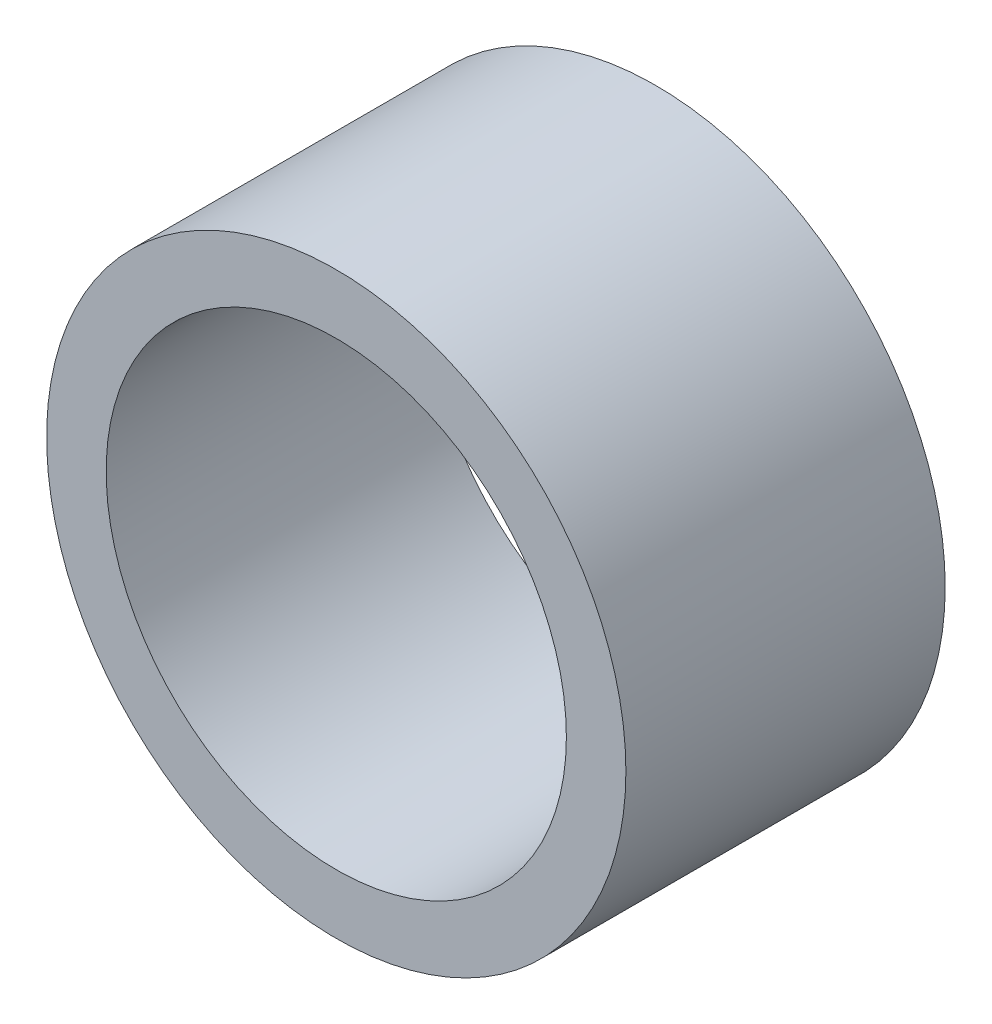
ISO-10303-21;
HEADER;
FILE_DESCRIPTION(('STEP AP214'),'2;1');
FILE_NAME('part.step','',(''),(''),'','','');
FILE_SCHEMA(('AUTOMOTIVE_DESIGN { 1 0 10303 214 1 1 1 1 }'));
ENDSEC;
DATA;
#1=APPLICATION_CONTEXT('core data for automotive mechanical design processes');
#2=APPLICATION_PROTOCOL_DEFINITION('international standard','automotive_design',2000,#1);
#3=PRODUCT_CONTEXT('',#1,'mechanical');
#4=PRODUCT('Part','Part','',(#3));
#5=PRODUCT_RELATED_PRODUCT_CATEGORY('part','',(#4));
#6=PRODUCT_DEFINITION_FORMATION('','',#4);
#7=PRODUCT_DEFINITION_CONTEXT('part definition',#1,'design');
#8=PRODUCT_DEFINITION('design','',#6,#7);
#9=PRODUCT_DEFINITION_SHAPE('','',#8);
#10=(LENGTH_UNIT() NAMED_UNIT(*) SI_UNIT(.MILLI.,.METRE.));
#11=(NAMED_UNIT(*) PLANE_ANGLE_UNIT() SI_UNIT($,.RADIAN.));
#12=(NAMED_UNIT(*) SI_UNIT($,.STERADIAN.) SOLID_ANGLE_UNIT());
#13=UNCERTAINTY_MEASURE_WITH_UNIT(LENGTH_MEASURE(1.E-05),#10,'distance_accuracy_value','');
#14=(GEOMETRIC_REPRESENTATION_CONTEXT(3) GLOBAL_UNCERTAINTY_ASSIGNED_CONTEXT((#13)) GLOBAL_UNIT_ASSIGNED_CONTEXT((#10,
#11,#12)) REPRESENTATION_CONTEXT('',''));
#15=CARTESIAN_POINT('',(0.,0.,0.));
#16=DIRECTION('',(0.,0.,1.));
#17=DIRECTION('',(1.,0.,0.));
#18=AXIS2_PLACEMENT_3D('',#15,#16,#17);
#19=CARTESIAN_POINT('',(0.,0.,-7.));
#20=DIRECTION('',(0.,0.,1.));
#21=DIRECTION('',(1.,0.,0.));
#22=AXIS2_PLACEMENT_3D('',#19,#20,#21);
#23=CYLINDRICAL_SURFACE('',#22,6.35);
#24=CARTESIAN_POINT('',(0.,0.,-7.));
#25=DIRECTION('',(0.,0.,1.));
#26=DIRECTION('',(1.,0.,0.));
#27=AXIS2_PLACEMENT_3D('',#24,#25,#26);
#28=CIRCLE('',#27,6.35);
#29=CARTESIAN_POINT('',(6.35,0.,-7.));
#30=VERTEX_POINT('',#29);
#31=EDGE_CURVE('E10',#30,#30,#28,.T.);
#32=ORIENTED_EDGE('',*,*,#31,.T.);
#33=EDGE_LOOP('',(#32));
#34=FACE_BOUND('',#33,.T.);
#35=CARTESIAN_POINT('',(0.,0.,0.));
#36=DIRECTION('',(0.,0.,1.));
#37=DIRECTION('',(1.,0.,0.));
#38=AXIS2_PLACEMENT_3D('',#35,#36,#37);
#39=CIRCLE('',#38,6.35);
#40=CARTESIAN_POINT('',(6.35,0.,0.));
#41=VERTEX_POINT('',#40);
#42=EDGE_CURVE('E31',#41,#41,#39,.T.);
#43=ORIENTED_EDGE('',*,*,#42,.F.);
#44=EDGE_LOOP('',(#43));
#45=FACE_BOUND('',#44,.T.);
#46=ADVANCED_FACE('F28',(#34,#45),#23,.T.);
#47=CARTESIAN_POINT('',(0.,0.,-7.));
#48=DIRECTION('',(0.,0.,1.));
#49=DIRECTION('',(1.,0.,0.));
#50=AXIS2_PLACEMENT_3D('',#47,#48,#49);
#51=PLANE('',#50);
#52=CARTESIAN_POINT('',(0.,0.,-7.));
#53=DIRECTION('',(0.,0.,1.));
#54=DIRECTION('',(1.,0.,0.));
#55=AXIS2_PLACEMENT_3D('',#52,#53,#54);
#56=CIRCLE('',#55,5.045);
#57=CARTESIAN_POINT('',(5.045,0.,-7.));
#58=VERTEX_POINT('',#57);
#59=EDGE_CURVE('E38',#58,#58,#56,.T.);
#60=ORIENTED_EDGE('',*,*,#59,.T.);
#61=EDGE_LOOP('',(#60));
#62=FACE_BOUND('',#61,.T.);
#63=ORIENTED_EDGE('',*,*,#31,.F.);
#64=EDGE_LOOP('',(#63));
#65=FACE_BOUND('',#64,.T.);
#66=ADVANCED_FACE('F46',(#62,#65),#51,.F.);
#67=CARTESIAN_POINT('',(0.,0.,0.));
#68=DIRECTION('',(0.,0.,1.));
#69=DIRECTION('',(1.,0.,0.));
#70=AXIS2_PLACEMENT_3D('',#67,#68,#69);
#71=PLANE('',#70);
#72=CARTESIAN_POINT('',(0.,0.,0.));
#73=DIRECTION('',(0.,0.,1.));
#74=DIRECTION('',(1.,0.,0.));
#75=AXIS2_PLACEMENT_3D('',#72,#73,#74);
#76=CIRCLE('',#75,5.045);
#77=CARTESIAN_POINT('',(5.045,0.,0.));
#78=VERTEX_POINT('',#77);
#79=EDGE_CURVE('E40',#78,#78,#76,.T.);
#80=ORIENTED_EDGE('',*,*,#79,.F.);
#81=EDGE_LOOP('',(#80));
#82=FACE_BOUND('',#81,.T.);
#83=ORIENTED_EDGE('',*,*,#42,.T.);
#84=EDGE_LOOP('',(#83));
#85=FACE_BOUND('',#84,.T.);
#86=ADVANCED_FACE('F52',(#82,#85),#71,.T.);
#87=CARTESIAN_POINT('',(0.,0.,-7.));
#88=DIRECTION('',(0.,0.,1.));
#89=DIRECTION('',(1.,0.,0.));
#90=AXIS2_PLACEMENT_3D('',#87,#88,#89);
#91=CYLINDRICAL_SURFACE('',#90,5.045);
#92=ORIENTED_EDGE('',*,*,#59,.F.);
#93=EDGE_LOOP('',(#92));
#94=FACE_BOUND('',#93,.T.);
#95=ORIENTED_EDGE('',*,*,#79,.T.);
#96=EDGE_LOOP('',(#95));
#97=FACE_BOUND('',#96,.T.);
#98=ADVANCED_FACE('F49',(#94,#97),#91,.F.);
#99=CLOSED_SHELL('',(#46,#66,#86,#98));
#100=MANIFOLD_SOLID_BREP('B2',#99);
#101=ADVANCED_BREP_SHAPE_REPRESENTATION('',(#18,#100),#14);
#102=SHAPE_DEFINITION_REPRESENTATION(#9,#101);
ENDSEC;
END-ISO-10303-21;
